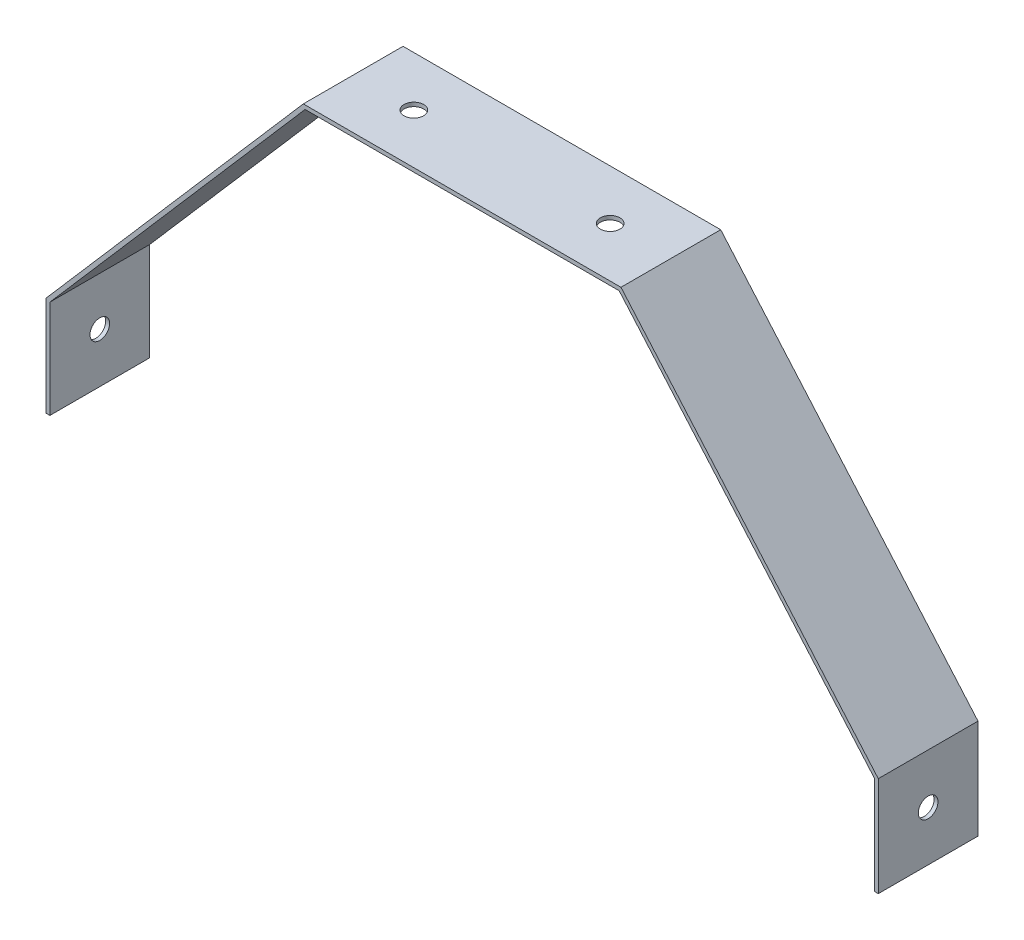
ISO-10303-21;
HEADER;
FILE_DESCRIPTION(('STEP AP214'),'2;1');
FILE_NAME('part.step','',(''),(''),'','','');
FILE_SCHEMA(('AUTOMOTIVE_DESIGN { 1 0 10303 214 1 1 1 1 }'));
ENDSEC;
DATA;
#1=APPLICATION_CONTEXT('core data for automotive mechanical design processes');
#2=APPLICATION_PROTOCOL_DEFINITION('international standard','automotive_design',2000,#1);
#3=PRODUCT_CONTEXT('',#1,'mechanical');
#4=PRODUCT('Part','Part','',(#3));
#5=PRODUCT_RELATED_PRODUCT_CATEGORY('part','',(#4));
#6=PRODUCT_DEFINITION_FORMATION('','',#4);
#7=PRODUCT_DEFINITION_CONTEXT('part definition',#1,'design');
#8=PRODUCT_DEFINITION('design','',#6,#7);
#9=PRODUCT_DEFINITION_SHAPE('','',#8);
#10=(LENGTH_UNIT() NAMED_UNIT(*) SI_UNIT(.MILLI.,.METRE.));
#11=(NAMED_UNIT(*) PLANE_ANGLE_UNIT() SI_UNIT($,.RADIAN.));
#12=(NAMED_UNIT(*) SI_UNIT($,.STERADIAN.) SOLID_ANGLE_UNIT());
#13=UNCERTAINTY_MEASURE_WITH_UNIT(LENGTH_MEASURE(1.E-05),#10,'distance_accuracy_value','');
#14=(GEOMETRIC_REPRESENTATION_CONTEXT(3) GLOBAL_UNCERTAINTY_ASSIGNED_CONTEXT((#13)) GLOBAL_UNIT_ASSIGNED_CONTEXT((#10,
#11,#12)) REPRESENTATION_CONTEXT('',''));
#15=CARTESIAN_POINT('',(0.,0.,0.));
#16=DIRECTION('',(0.,0.,1.));
#17=DIRECTION('',(1.,0.,0.));
#18=AXIS2_PLACEMENT_3D('',#15,#16,#17);
#19=CARTESIAN_POINT('',(-106.,-100.,25.4));
#20=DIRECTION('',(1.,0.,0.));
#21=DIRECTION('',(0.,0.,-1.));
#22=AXIS2_PLACEMENT_3D('',#19,#20,#21);
#23=PLANE('',#22);
#24=CARTESIAN_POINT('',(-106.,-87.3134833368739,12.7));
#25=DIRECTION('',(1.,0.,0.));
#26=DIRECTION('',(0.,0.,-1.));
#27=AXIS2_PLACEMENT_3D('',#24,#25,#26);
#28=CIRCLE('',#27,2.5);
#29=CARTESIAN_POINT('',(-106.,-87.3134833368739,10.2));
#30=VERTEX_POINT('',#29);
#31=EDGE_CURVE('E310',#30,#30,#28,.T.);
#32=ORIENTED_EDGE('',*,*,#31,.T.);
#33=EDGE_LOOP('',(#32));
#34=FACE_BOUND('',#33,.T.);
#35=DIRECTION('',(0.,1.,0.));
#36=VECTOR('',#35,1.);
#37=CARTESIAN_POINT('',(-106.,-100.,0.));
#38=LINE('',#37,#36);
#39=CARTESIAN_POINT('',(-106.,-74.6269666737478,0.));
#40=VERTEX_POINT('',#39);
#41=CARTESIAN_POINT('',(-106.,-100.,0.));
#42=VERTEX_POINT('',#41);
#43=EDGE_CURVE('E168',#40,#42,#38,.F.);
#44=ORIENTED_EDGE('',*,*,#43,.T.);
#45=DIRECTION('',(0.,0.,-1.));
#46=VECTOR('',#45,1.);
#47=CARTESIAN_POINT('',(-106.,-100.,25.4));
#48=LINE('',#47,#46);
#49=CARTESIAN_POINT('',(-106.,-100.,25.4));
#50=VERTEX_POINT('',#49);
#51=EDGE_CURVE('E11',#50,#42,#48,.T.);
#52=ORIENTED_EDGE('',*,*,#51,.F.);
#53=DIRECTION('',(0.,1.,0.));
#54=VECTOR('',#53,1.);
#55=CARTESIAN_POINT('',(-106.,-100.,25.4));
#56=LINE('',#55,#54);
#57=CARTESIAN_POINT('',(-106.,-74.6269666737478,25.4));
#58=VERTEX_POINT('',#57);
#59=EDGE_CURVE('E112',#58,#50,#56,.F.);
#60=ORIENTED_EDGE('',*,*,#59,.F.);
#61=DIRECTION('',(0.,0.,-1.));
#62=VECTOR('',#61,1.);
#63=CARTESIAN_POINT('',(-106.,-74.6269666737478,25.4));
#64=LINE('',#63,#62);
#65=EDGE_CURVE('E164',#58,#40,#64,.T.);
#66=ORIENTED_EDGE('',*,*,#65,.T.);
#67=EDGE_LOOP('',(#44,#52,#60,#66));
#68=FACE_BOUND('',#67,.T.);
#69=ADVANCED_FACE('F43',(#34,#68),#23,.F.);
#70=CARTESIAN_POINT('',(-105.,-100.,25.4));
#71=DIRECTION('',(0.,-1.,0.));
#72=DIRECTION('',(0.,0.,-1.));
#73=AXIS2_PLACEMENT_3D('',#70,#71,#72);
#74=PLANE('',#73);
#75=DIRECTION('',(-1.,0.,0.));
#76=VECTOR('',#75,1.);
#77=CARTESIAN_POINT('',(-105.,-100.,0.));
#78=LINE('',#77,#76);
#79=CARTESIAN_POINT('',(-105.,-100.,0.));
#80=VERTEX_POINT('',#79);
#81=EDGE_CURVE('E172',#80,#42,#78,.T.);
#82=ORIENTED_EDGE('',*,*,#81,.F.);
#83=DIRECTION('',(0.,0.,-1.));
#84=VECTOR('',#83,1.);
#85=CARTESIAN_POINT('',(-105.,-100.,25.4));
#86=LINE('',#85,#84);
#87=CARTESIAN_POINT('',(-105.,-100.,25.4));
#88=VERTEX_POINT('',#87);
#89=EDGE_CURVE('E52',#88,#80,#86,.T.);
#90=ORIENTED_EDGE('',*,*,#89,.F.);
#91=DIRECTION('',(-1.,0.,0.));
#92=VECTOR('',#91,1.);
#93=CARTESIAN_POINT('',(-105.,-100.,25.4));
#94=LINE('',#93,#92);
#95=EDGE_CURVE('E256',#88,#50,#94,.T.);
#96=ORIENTED_EDGE('',*,*,#95,.T.);
#97=ORIENTED_EDGE('',*,*,#51,.T.);
#98=EDGE_LOOP('',(#82,#90,#96,#97));
#99=FACE_BOUND('',#98,.T.);
#100=ADVANCED_FACE('F243',(#99),#74,.T.);
#101=CARTESIAN_POINT('',(-105.,-100.,25.4));
#102=DIRECTION('',(1.,0.,0.));
#103=DIRECTION('',(0.,0.,-1.));
#104=AXIS2_PLACEMENT_3D('',#101,#102,#103);
#105=PLANE('',#104);
#106=CARTESIAN_POINT('',(-105.,-87.3134833368739,12.7));
#107=DIRECTION('',(1.,0.,0.));
#108=DIRECTION('',(0.,0.,-1.));
#109=AXIS2_PLACEMENT_3D('',#106,#107,#108);
#110=CIRCLE('',#109,2.5);
#111=CARTESIAN_POINT('',(-105.,-87.3134833368739,10.2));
#112=VERTEX_POINT('',#111);
#113=EDGE_CURVE('E353',#112,#112,#110,.T.);
#114=ORIENTED_EDGE('',*,*,#113,.F.);
#115=EDGE_LOOP('',(#114));
#116=FACE_BOUND('',#115,.T.);
#117=DIRECTION('',(0.,-1.,0.));
#118=VECTOR('',#117,1.);
#119=CARTESIAN_POINT('',(-105.,-100.,0.));
#120=LINE('',#119,#118);
#121=CARTESIAN_POINT('',(-105.,-75.,0.));
#122=VERTEX_POINT('',#121);
#123=EDGE_CURVE('E177',#122,#80,#120,.T.);
#124=ORIENTED_EDGE('',*,*,#123,.F.);
#125=DIRECTION('',(0.,0.,-1.));
#126=VECTOR('',#125,1.);
#127=CARTESIAN_POINT('',(-105.,-75.,25.4));
#128=LINE('',#127,#126);
#129=CARTESIAN_POINT('',(-105.,-75.,25.4));
#130=VERTEX_POINT('',#129);
#131=EDGE_CURVE('E231',#130,#122,#128,.T.);
#132=ORIENTED_EDGE('',*,*,#131,.F.);
#133=DIRECTION('',(0.,-1.,0.));
#134=VECTOR('',#133,1.);
#135=CARTESIAN_POINT('',(-105.,-100.,25.4));
#136=LINE('',#135,#134);
#137=EDGE_CURVE('E240',#130,#88,#136,.T.);
#138=ORIENTED_EDGE('',*,*,#137,.T.);
#139=ORIENTED_EDGE('',*,*,#89,.T.);
#140=EDGE_LOOP('',(#124,#132,#138,#139));
#141=FACE_BOUND('',#140,.T.);
#142=ADVANCED_FACE('F238',(#116,#141),#105,.T.);
#143=CARTESIAN_POINT('',(-105.,-75.,25.4));
#144=DIRECTION('',(0.755689082789818,-0.654930538417841,0.));
#145=DIRECTION('',(0.654930538417842,0.755689082789818,0.));
#146=AXIS2_PLACEMENT_3D('',#143,#144,#145);
#147=PLANE('',#146);
#148=DIRECTION('',(-0.654930538417842,-0.755689082789818,0.));
#149=VECTOR('',#148,1.);
#150=CARTESIAN_POINT('',(-105.,-75.,0.));
#151=LINE('',#150,#149);
#152=CARTESIAN_POINT('',(-40.,0.,0.));
#153=VERTEX_POINT('',#152);
#154=EDGE_CURVE('E181',#153,#122,#151,.T.);
#155=ORIENTED_EDGE('',*,*,#154,.F.);
#156=DIRECTION('',(0.,0.,-1.));
#157=VECTOR('',#156,1.);
#158=CARTESIAN_POINT('',(-40.,0.,25.4));
#159=LINE('',#158,#157);
#160=CARTESIAN_POINT('',(-40.,0.,25.4));
#161=VERTEX_POINT('',#160);
#162=EDGE_CURVE('E228',#161,#153,#159,.T.);
#163=ORIENTED_EDGE('',*,*,#162,.F.);
#164=DIRECTION('',(-0.654930538417842,-0.755689082789818,0.));
#165=VECTOR('',#164,1.);
#166=CARTESIAN_POINT('',(-105.,-75.,25.4));
#167=LINE('',#166,#165);
#168=EDGE_CURVE('E253',#161,#130,#167,.T.);
#169=ORIENTED_EDGE('',*,*,#168,.T.);
#170=ORIENTED_EDGE('',*,*,#131,.T.);
#171=EDGE_LOOP('',(#155,#163,#169,#170));
#172=FACE_BOUND('',#171,.T.);
#173=ADVANCED_FACE('F250',(#172),#147,.T.);
#174=CARTESIAN_POINT('',(-40.,0.,25.4));
#175=DIRECTION('',(0.,-1.,0.));
#176=DIRECTION('',(0.,0.,-1.));
#177=AXIS2_PLACEMENT_3D('',#174,#175,#176);
#178=PLANE('',#177);
#179=CARTESIAN_POINT('',(-25.,0.,12.7));
#180=DIRECTION('',(0.,-1.,0.));
#181=DIRECTION('',(0.,0.,-1.));
#182=AXIS2_PLACEMENT_3D('',#179,#180,#181);
#183=CIRCLE('',#182,2.5);
#184=CARTESIAN_POINT('',(-25.,0.,10.2));
#185=VERTEX_POINT('',#184);
#186=EDGE_CURVE('E173',#185,#185,#183,.T.);
#187=ORIENTED_EDGE('',*,*,#186,.F.);
#188=EDGE_LOOP('',(#187));
#189=FACE_BOUND('',#188,.T.);
#190=CARTESIAN_POINT('',(25.,0.,12.7));
#191=DIRECTION('',(0.,-1.,0.));
#192=DIRECTION('',(0.,0.,-1.));
#193=AXIS2_PLACEMENT_3D('',#190,#191,#192);
#194=CIRCLE('',#193,2.5);
#195=CARTESIAN_POINT('',(25.,0.,10.2));
#196=VERTEX_POINT('',#195);
#197=EDGE_CURVE('E362',#196,#196,#194,.T.);
#198=ORIENTED_EDGE('',*,*,#197,.F.);
#199=EDGE_LOOP('',(#198));
#200=FACE_BOUND('',#199,.T.);
#201=DIRECTION('',(-1.,0.,0.));
#202=VECTOR('',#201,1.);
#203=CARTESIAN_POINT('',(-40.,0.,0.));
#204=LINE('',#203,#202);
#205=CARTESIAN_POINT('',(40.,0.,0.));
#206=VERTEX_POINT('',#205);
#207=EDGE_CURVE('E185',#206,#153,#204,.T.);
#208=ORIENTED_EDGE('',*,*,#207,.F.);
#209=DIRECTION('',(0.,0.,-1.));
#210=VECTOR('',#209,1.);
#211=CARTESIAN_POINT('',(40.,0.,25.4));
#212=LINE('',#211,#210);
#213=CARTESIAN_POINT('',(40.,0.,25.4));
#214=VERTEX_POINT('',#213);
#215=EDGE_CURVE('E225',#214,#206,#212,.T.);
#216=ORIENTED_EDGE('',*,*,#215,.F.);
#217=DIRECTION('',(-1.,0.,0.));
#218=VECTOR('',#217,1.);
#219=CARTESIAN_POINT('',(-40.,0.,25.4));
#220=LINE('',#219,#218);
#221=EDGE_CURVE('E261',#214,#161,#220,.T.);
#222=ORIENTED_EDGE('',*,*,#221,.T.);
#223=ORIENTED_EDGE('',*,*,#162,.T.);
#224=EDGE_LOOP('',(#208,#216,#222,#223));
#225=FACE_BOUND('',#224,.T.);
#226=ADVANCED_FACE('F375',(#189,#200,#225),#178,.T.);
#227=CARTESIAN_POINT('',(40.,0.,25.4));
#228=DIRECTION('',(-0.755689082789818,-0.654930538417842,0.));
#229=DIRECTION('',(0.654930538417842,-0.755689082789818,0.));
#230=AXIS2_PLACEMENT_3D('',#227,#228,#229);
#231=PLANE('',#230);
#232=DIRECTION('',(-0.654930538417842,0.755689082789818,0.));
#233=VECTOR('',#232,1.);
#234=CARTESIAN_POINT('',(40.,0.,0.));
#235=LINE('',#234,#233);
#236=CARTESIAN_POINT('',(105.,-75.,0.));
#237=VERTEX_POINT('',#236);
#238=EDGE_CURVE('E189',#237,#206,#235,.T.);
#239=ORIENTED_EDGE('',*,*,#238,.F.);
#240=DIRECTION('',(0.,0.,-1.));
#241=VECTOR('',#240,1.);
#242=CARTESIAN_POINT('',(105.,-75.,25.4));
#243=LINE('',#242,#241);
#244=CARTESIAN_POINT('',(105.,-75.,25.4));
#245=VERTEX_POINT('',#244);
#246=EDGE_CURVE('E222',#245,#237,#243,.T.);
#247=ORIENTED_EDGE('',*,*,#246,.F.);
#248=DIRECTION('',(-0.654930538417842,0.755689082789818,0.));
#249=VECTOR('',#248,1.);
#250=CARTESIAN_POINT('',(40.,0.,25.4));
#251=LINE('',#250,#249);
#252=EDGE_CURVE('E268',#245,#214,#251,.T.);
#253=ORIENTED_EDGE('',*,*,#252,.T.);
#254=ORIENTED_EDGE('',*,*,#215,.T.);
#255=EDGE_LOOP('',(#239,#247,#253,#254));
#256=FACE_BOUND('',#255,.T.);
#257=ADVANCED_FACE('F378',(#256),#231,.T.);
#258=CARTESIAN_POINT('',(105.,-100.,25.4));
#259=DIRECTION('',(-1.,0.,0.));
#260=DIRECTION('',(0.,0.,1.));
#261=AXIS2_PLACEMENT_3D('',#258,#259,#260);
#262=PLANE('',#261);
#263=CARTESIAN_POINT('',(105.,-87.3134833368739,12.7));
#264=DIRECTION('',(-1.,0.,0.));
#265=DIRECTION('',(0.,0.,1.));
#266=AXIS2_PLACEMENT_3D('',#263,#264,#265);
#267=CIRCLE('',#266,2.5);
#268=CARTESIAN_POINT('',(105.,-87.3134833368739,15.2));
#269=VERTEX_POINT('',#268);
#270=EDGE_CURVE('E343',#269,#269,#267,.T.);
#271=ORIENTED_EDGE('',*,*,#270,.F.);
#272=EDGE_LOOP('',(#271));
#273=FACE_BOUND('',#272,.T.);
#274=DIRECTION('',(0.,1.,0.));
#275=VECTOR('',#274,1.);
#276=CARTESIAN_POINT('',(105.,-100.,0.));
#277=LINE('',#276,#275);
#278=CARTESIAN_POINT('',(105.,-100.,0.));
#279=VERTEX_POINT('',#278);
#280=EDGE_CURVE('E193',#279,#237,#277,.T.);
#281=ORIENTED_EDGE('',*,*,#280,.F.);
#282=DIRECTION('',(0.,0.,-1.));
#283=VECTOR('',#282,1.);
#284=CARTESIAN_POINT('',(105.,-100.,25.4));
#285=LINE('',#284,#283);
#286=CARTESIAN_POINT('',(105.,-100.,25.4));
#287=VERTEX_POINT('',#286);
#288=EDGE_CURVE('E219',#287,#279,#285,.T.);
#289=ORIENTED_EDGE('',*,*,#288,.F.);
#290=DIRECTION('',(0.,1.,0.));
#291=VECTOR('',#290,1.);
#292=CARTESIAN_POINT('',(105.,-100.,25.4));
#293=LINE('',#292,#291);
#294=EDGE_CURVE('E272',#287,#245,#293,.T.);
#295=ORIENTED_EDGE('',*,*,#294,.T.);
#296=ORIENTED_EDGE('',*,*,#246,.T.);
#297=EDGE_LOOP('',(#281,#289,#295,#296));
#298=FACE_BOUND('',#297,.T.);
#299=ADVANCED_FACE('F287',(#273,#298),#262,.T.);
#300=CARTESIAN_POINT('',(106.,-100.,25.4));
#301=DIRECTION('',(0.,-1.,0.));
#302=DIRECTION('',(0.,0.,-1.));
#303=AXIS2_PLACEMENT_3D('',#300,#301,#302);
#304=PLANE('',#303);
#305=DIRECTION('',(-1.,0.,0.));
#306=VECTOR('',#305,1.);
#307=CARTESIAN_POINT('',(106.,-100.,0.));
#308=LINE('',#307,#306);
#309=CARTESIAN_POINT('',(106.,-100.,0.));
#310=VERTEX_POINT('',#309);
#311=EDGE_CURVE('E197',#310,#279,#308,.T.);
#312=ORIENTED_EDGE('',*,*,#311,.F.);
#313=DIRECTION('',(0.,0.,-1.));
#314=VECTOR('',#313,1.);
#315=CARTESIAN_POINT('',(106.,-100.,25.4));
#316=LINE('',#315,#314);
#317=CARTESIAN_POINT('',(106.,-100.,25.4));
#318=VERTEX_POINT('',#317);
#319=EDGE_CURVE('E216',#318,#310,#316,.T.);
#320=ORIENTED_EDGE('',*,*,#319,.F.);
#321=DIRECTION('',(-1.,0.,0.));
#322=VECTOR('',#321,1.);
#323=CARTESIAN_POINT('',(106.,-100.,25.4));
#324=LINE('',#323,#322);
#325=EDGE_CURVE('E276',#318,#287,#324,.T.);
#326=ORIENTED_EDGE('',*,*,#325,.T.);
#327=ORIENTED_EDGE('',*,*,#288,.T.);
#328=EDGE_LOOP('',(#312,#320,#326,#327));
#329=FACE_BOUND('',#328,.T.);
#330=ADVANCED_FACE('F282',(#329),#304,.T.);
#331=CARTESIAN_POINT('',(106.,-100.,25.4));
#332=DIRECTION('',(-1.,0.,0.));
#333=DIRECTION('',(0.,0.,1.));
#334=AXIS2_PLACEMENT_3D('',#331,#332,#333);
#335=PLANE('',#334);
#336=CARTESIAN_POINT('',(106.,-87.3134833368739,12.7));
#337=DIRECTION('',(1.,0.,0.));
#338=DIRECTION('',(0.,0.,-1.));
#339=AXIS2_PLACEMENT_3D('',#336,#337,#338);
#340=CIRCLE('',#339,2.5);
#341=CARTESIAN_POINT('',(106.,-87.3134833368739,10.2));
#342=VERTEX_POINT('',#341);
#343=EDGE_CURVE('E345',#342,#342,#340,.T.);
#344=ORIENTED_EDGE('',*,*,#343,.F.);
#345=EDGE_LOOP('',(#344));
#346=FACE_BOUND('',#345,.T.);
#347=DIRECTION('',(0.,1.,0.));
#348=VECTOR('',#347,1.);
#349=CARTESIAN_POINT('',(106.,-100.,0.));
#350=LINE('',#349,#348);
#351=CARTESIAN_POINT('',(106.,-74.6269666737478,0.));
#352=VERTEX_POINT('',#351);
#353=EDGE_CURVE('E201',#310,#352,#350,.T.);
#354=ORIENTED_EDGE('',*,*,#353,.T.);
#355=DIRECTION('',(0.,0.,-1.));
#356=VECTOR('',#355,1.);
#357=CARTESIAN_POINT('',(106.,-74.6269666737478,25.4));
#358=LINE('',#357,#356);
#359=CARTESIAN_POINT('',(106.,-74.6269666737478,25.4));
#360=VERTEX_POINT('',#359);
#361=EDGE_CURVE('E157',#360,#352,#358,.T.);
#362=ORIENTED_EDGE('',*,*,#361,.F.);
#363=DIRECTION('',(0.,1.,0.));
#364=VECTOR('',#363,1.);
#365=CARTESIAN_POINT('',(106.,-100.,25.4));
#366=LINE('',#365,#364);
#367=EDGE_CURVE('E146',#318,#360,#366,.T.);
#368=ORIENTED_EDGE('',*,*,#367,.F.);
#369=ORIENTED_EDGE('',*,*,#319,.T.);
#370=EDGE_LOOP('',(#354,#362,#368,#369));
#371=FACE_BOUND('',#370,.T.);
#372=ADVANCED_FACE('F291',(#346,#371),#335,.F.);
#373=CARTESIAN_POINT('',(40.7556890827898,0.654930538417842,25.4));
#374=DIRECTION('',(-0.755689082789818,-0.654930538417842,0.));
#375=DIRECTION('',(0.654930538417842,-0.755689082789818,0.));
#376=AXIS2_PLACEMENT_3D('',#373,#374,#375);
#377=PLANE('',#376);
#378=DIRECTION('',(-0.654930538417842,0.755689082789818,0.));
#379=VECTOR('',#378,1.);
#380=CARTESIAN_POINT('',(40.7556890827898,0.654930538417842,0.));
#381=LINE('',#380,#379);
#382=CARTESIAN_POINT('',(40.456628882752,1.,0.));
#383=VERTEX_POINT('',#382);
#384=EDGE_CURVE('E155',#352,#383,#381,.T.);
#385=ORIENTED_EDGE('',*,*,#384,.T.);
#386=DIRECTION('',(0.,0.,-1.));
#387=VECTOR('',#386,1.);
#388=CARTESIAN_POINT('',(40.456628882752,1.,25.4));
#389=LINE('',#388,#387);
#390=CARTESIAN_POINT('',(40.456628882752,1.,25.4));
#391=VERTEX_POINT('',#390);
#392=EDGE_CURVE('E152',#391,#383,#389,.T.);
#393=ORIENTED_EDGE('',*,*,#392,.F.);
#394=DIRECTION('',(-0.654930538417842,0.755689082789818,0.));
#395=VECTOR('',#394,1.);
#396=CARTESIAN_POINT('',(40.7556890827898,0.654930538417842,25.4));
#397=LINE('',#396,#395);
#398=EDGE_CURVE('E139',#360,#391,#397,.T.);
#399=ORIENTED_EDGE('',*,*,#398,.F.);
#400=ORIENTED_EDGE('',*,*,#361,.T.);
#401=EDGE_LOOP('',(#385,#393,#399,#400));
#402=FACE_BOUND('',#401,.T.);
#403=ADVANCED_FACE('F153',(#402),#377,.F.);
#404=CARTESIAN_POINT('',(-40.,1.,25.4));
#405=DIRECTION('',(0.,-1.,0.));
#406=DIRECTION('',(0.,0.,-1.));
#407=AXIS2_PLACEMENT_3D('',#404,#405,#406);
#408=PLANE('',#407);
#409=CARTESIAN_POINT('',(-25.,1.,12.7));
#410=DIRECTION('',(0.,1.,0.));
#411=DIRECTION('',(0.,0.,1.));
#412=AXIS2_PLACEMENT_3D('',#409,#410,#411);
#413=CIRCLE('',#412,2.5);
#414=CARTESIAN_POINT('',(-25.,1.,15.2));
#415=VERTEX_POINT('',#414);
#416=EDGE_CURVE('E358',#415,#415,#413,.T.);
#417=ORIENTED_EDGE('',*,*,#416,.F.);
#418=EDGE_LOOP('',(#417));
#419=FACE_BOUND('',#418,.T.);
#420=CARTESIAN_POINT('',(25.,1.,12.7));
#421=DIRECTION('',(0.,1.,0.));
#422=DIRECTION('',(0.,0.,1.));
#423=AXIS2_PLACEMENT_3D('',#420,#421,#422);
#424=CIRCLE('',#423,2.5);
#425=CARTESIAN_POINT('',(25.,1.,15.2));
#426=VERTEX_POINT('',#425);
#427=EDGE_CURVE('E357',#426,#426,#424,.T.);
#428=ORIENTED_EDGE('',*,*,#427,.F.);
#429=EDGE_LOOP('',(#428));
#430=FACE_BOUND('',#429,.T.);
#431=DIRECTION('',(1.,0.,0.));
#432=VECTOR('',#431,1.);
#433=CARTESIAN_POINT('',(-40.,1.,0.));
#434=LINE('',#433,#432);
#435=CARTESIAN_POINT('',(-40.456628882752,0.999999999999987,0.));
#436=VERTEX_POINT('',#435);
#437=EDGE_CURVE('E100',#383,#436,#434,.F.);
#438=ORIENTED_EDGE('',*,*,#437,.T.);
#439=DIRECTION('',(0.,0.,-1.));
#440=VECTOR('',#439,1.);
#441=CARTESIAN_POINT('',(-40.456628882752,0.999999999999987,25.4));
#442=LINE('',#441,#440);
#443=CARTESIAN_POINT('',(-40.456628882752,0.999999999999987,25.4));
#444=VERTEX_POINT('',#443);
#445=EDGE_CURVE('E158',#444,#436,#442,.T.);
#446=ORIENTED_EDGE('',*,*,#445,.F.);
#447=DIRECTION('',(1.,0.,0.));
#448=VECTOR('',#447,1.);
#449=CARTESIAN_POINT('',(-40.,1.,25.4));
#450=LINE('',#449,#448);
#451=EDGE_CURVE('E143',#391,#444,#450,.F.);
#452=ORIENTED_EDGE('',*,*,#451,.F.);
#453=ORIENTED_EDGE('',*,*,#392,.T.);
#454=EDGE_LOOP('',(#438,#446,#452,#453));
#455=FACE_BOUND('',#454,.T.);
#456=ADVANCED_FACE('F160',(#419,#430,#455),#408,.F.);
#457=CARTESIAN_POINT('',(-105.75568908279,-74.3450694615822,25.4));
#458=DIRECTION('',(0.755689082789818,-0.654930538417842,0.));
#459=DIRECTION('',(0.654930538417842,0.755689082789818,0.));
#460=AXIS2_PLACEMENT_3D('',#457,#458,#459);
#461=PLANE('',#460);
#462=DIRECTION('',(-0.654930538417841,-0.755689082789818,0.));
#463=VECTOR('',#462,1.);
#464=CARTESIAN_POINT('',(-105.75568908279,-74.3450694615822,0.));
#465=LINE('',#464,#463);
#466=EDGE_CURVE('E106',#436,#40,#465,.T.);
#467=ORIENTED_EDGE('',*,*,#466,.T.);
#468=ORIENTED_EDGE('',*,*,#65,.F.);
#469=DIRECTION('',(-0.654930538417841,-0.755689082789818,0.));
#470=VECTOR('',#469,1.);
#471=CARTESIAN_POINT('',(-105.75568908279,-74.3450694615822,25.4));
#472=LINE('',#471,#470);
#473=EDGE_CURVE('E60',#444,#58,#472,.T.);
#474=ORIENTED_EDGE('',*,*,#473,.F.);
#475=ORIENTED_EDGE('',*,*,#445,.T.);
#476=EDGE_LOOP('',(#467,#468,#474,#475));
#477=FACE_BOUND('',#476,.T.);
#478=ADVANCED_FACE('F311',(#477),#461,.F.);
#479=CARTESIAN_POINT('',(0.,0.,25.4));
#480=DIRECTION('',(0.,0.,1.));
#481=DIRECTION('',(1.,0.,0.));
#482=AXIS2_PLACEMENT_3D('',#479,#480,#481);
#483=PLANE('',#482);
#484=ORIENTED_EDGE('',*,*,#59,.T.);
#485=ORIENTED_EDGE('',*,*,#95,.F.);
#486=ORIENTED_EDGE('',*,*,#137,.F.);
#487=ORIENTED_EDGE('',*,*,#168,.F.);
#488=ORIENTED_EDGE('',*,*,#221,.F.);
#489=ORIENTED_EDGE('',*,*,#252,.F.);
#490=ORIENTED_EDGE('',*,*,#294,.F.);
#491=ORIENTED_EDGE('',*,*,#325,.F.);
#492=ORIENTED_EDGE('',*,*,#367,.T.);
#493=ORIENTED_EDGE('',*,*,#398,.T.);
#494=ORIENTED_EDGE('',*,*,#451,.T.);
#495=ORIENTED_EDGE('',*,*,#473,.T.);
#496=EDGE_LOOP('',(#484,#485,#486,#487,#488,#489,#490,#491,#492,#493,#494,#495));
#497=FACE_BOUND('',#496,.T.);
#498=ADVANCED_FACE('F141',(#497),#483,.T.);
#499=CARTESIAN_POINT('',(0.,0.,0.));
#500=DIRECTION('',(0.,0.,1.));
#501=DIRECTION('',(1.,0.,0.));
#502=AXIS2_PLACEMENT_3D('',#499,#500,#501);
#503=PLANE('',#502);
#504=ORIENTED_EDGE('',*,*,#43,.F.);
#505=ORIENTED_EDGE('',*,*,#466,.F.);
#506=ORIENTED_EDGE('',*,*,#437,.F.);
#507=ORIENTED_EDGE('',*,*,#384,.F.);
#508=ORIENTED_EDGE('',*,*,#353,.F.);
#509=ORIENTED_EDGE('',*,*,#311,.T.);
#510=ORIENTED_EDGE('',*,*,#280,.T.);
#511=ORIENTED_EDGE('',*,*,#238,.T.);
#512=ORIENTED_EDGE('',*,*,#207,.T.);
#513=ORIENTED_EDGE('',*,*,#154,.T.);
#514=ORIENTED_EDGE('',*,*,#123,.T.);
#515=ORIENTED_EDGE('',*,*,#81,.T.);
#516=EDGE_LOOP('',(#504,#505,#506,#507,#508,#509,#510,#511,#512,#513,#514,#515));
#517=FACE_BOUND('',#516,.T.);
#518=ADVANCED_FACE('F246',(#517),#503,.F.);
#519=CARTESIAN_POINT('',(25.,-9.,12.7));
#520=DIRECTION('',(0.,1.,0.));
#521=DIRECTION('',(0.,0.,1.));
#522=AXIS2_PLACEMENT_3D('',#519,#520,#521);
#523=CYLINDRICAL_SURFACE('',#522,2.5);
#524=ORIENTED_EDGE('',*,*,#197,.T.);
#525=EDGE_LOOP('',(#524));
#526=FACE_BOUND('',#525,.T.);
#527=ORIENTED_EDGE('',*,*,#427,.T.);
#528=EDGE_LOOP('',(#527));
#529=FACE_BOUND('',#528,.T.);
#530=ADVANCED_FACE('F323',(#526,#529),#523,.F.);
#531=CARTESIAN_POINT('',(-25.,-9.,12.7));
#532=DIRECTION('',(0.,1.,0.));
#533=DIRECTION('',(0.,0.,1.));
#534=AXIS2_PLACEMENT_3D('',#531,#532,#533);
#535=CYLINDRICAL_SURFACE('',#534,2.5);
#536=ORIENTED_EDGE('',*,*,#186,.T.);
#537=EDGE_LOOP('',(#536));
#538=FACE_BOUND('',#537,.T.);
#539=ORIENTED_EDGE('',*,*,#416,.T.);
#540=EDGE_LOOP('',(#539));
#541=FACE_BOUND('',#540,.T.);
#542=ADVANCED_FACE('F327',(#538,#541),#535,.F.);
#543=CARTESIAN_POINT('',(-106.,-87.3134833368739,12.7));
#544=DIRECTION('',(1.,0.,0.));
#545=DIRECTION('',(0.,0.,-1.));
#546=AXIS2_PLACEMENT_3D('',#543,#544,#545);
#547=CYLINDRICAL_SURFACE('',#546,2.5);
#548=ORIENTED_EDGE('',*,*,#270,.T.);
#549=EDGE_LOOP('',(#548));
#550=FACE_BOUND('',#549,.T.);
#551=ORIENTED_EDGE('',*,*,#343,.T.);
#552=EDGE_LOOP('',(#551));
#553=FACE_BOUND('',#552,.T.);
#554=ADVANCED_FACE('F331',(#550,#553),#547,.F.);
#555=ORIENTED_EDGE('',*,*,#113,.T.);
#556=EDGE_LOOP('',(#555));
#557=FACE_BOUND('',#556,.T.);
#558=ORIENTED_EDGE('',*,*,#31,.F.);
#559=EDGE_LOOP('',(#558));
#560=FACE_BOUND('',#559,.T.);
#561=ADVANCED_FACE('F334',(#557,#560),#547,.F.);
#562=CLOSED_SHELL('',(#69,#100,#142,#173,#226,#257,#299,#330,#372,#403,#456,#478,#498,#518,#530,
#542,#554,#561));
#563=MANIFOLD_SOLID_BREP('B2',#562);
#564=ADVANCED_BREP_SHAPE_REPRESENTATION('',(#18,#563),#14);
#565=SHAPE_DEFINITION_REPRESENTATION(#9,#564);
ENDSEC;
END-ISO-10303-21;
